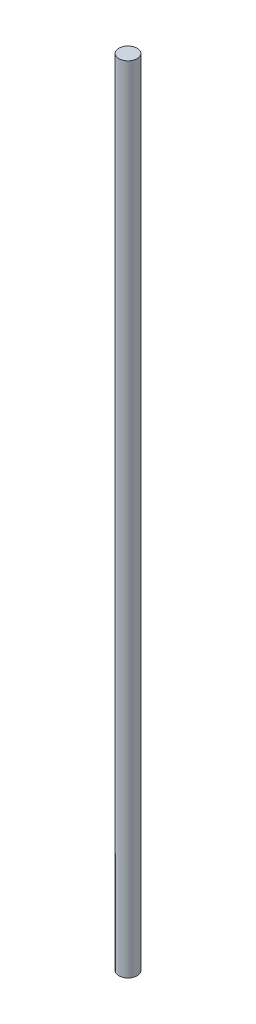
ISO-10303-21;
HEADER;
FILE_DESCRIPTION(('STEP AP214'),'2;1');
FILE_NAME('part.step','',(''),(''),'','','');
FILE_SCHEMA(('AUTOMOTIVE_DESIGN { 1 0 10303 214 1 1 1 1 }'));
ENDSEC;
DATA;
#1=APPLICATION_CONTEXT('core data for automotive mechanical design processes');
#2=APPLICATION_PROTOCOL_DEFINITION('international standard','automotive_design',2000,#1);
#3=PRODUCT_CONTEXT('',#1,'mechanical');
#4=PRODUCT('Part','Part','',(#3));
#5=PRODUCT_RELATED_PRODUCT_CATEGORY('part','',(#4));
#6=PRODUCT_DEFINITION_FORMATION('','',#4);
#7=PRODUCT_DEFINITION_CONTEXT('part definition',#1,'design');
#8=PRODUCT_DEFINITION('design','',#6,#7);
#9=PRODUCT_DEFINITION_SHAPE('','',#8);
#10=(LENGTH_UNIT() NAMED_UNIT(*) SI_UNIT(.MILLI.,.METRE.));
#11=(NAMED_UNIT(*) PLANE_ANGLE_UNIT() SI_UNIT($,.RADIAN.));
#12=(NAMED_UNIT(*) SI_UNIT($,.STERADIAN.) SOLID_ANGLE_UNIT());
#13=UNCERTAINTY_MEASURE_WITH_UNIT(LENGTH_MEASURE(1.E-05),#10,'distance_accuracy_value','');
#14=(GEOMETRIC_REPRESENTATION_CONTEXT(3) GLOBAL_UNCERTAINTY_ASSIGNED_CONTEXT((#13)) GLOBAL_UNIT_ASSIGNED_CONTEXT((#10,
#11,#12)) REPRESENTATION_CONTEXT('',''));
#15=CARTESIAN_POINT('',(0.,0.,0.));
#16=DIRECTION('',(0.,0.,1.));
#17=DIRECTION('',(1.,0.,0.));
#18=AXIS2_PLACEMENT_3D('',#15,#16,#17);
#19=CARTESIAN_POINT('',(0.,366.8,0.));
#20=DIRECTION('',(0.,-1.,0.));
#21=DIRECTION('',(0.,0.,-1.));
#22=AXIS2_PLACEMENT_3D('',#19,#20,#21);
#23=CYLINDRICAL_SURFACE('',#22,4.2);
#24=CARTESIAN_POINT('',(0.,366.8,0.));
#25=DIRECTION('',(0.,1.,0.));
#26=DIRECTION('',(0.,0.,1.));
#27=AXIS2_PLACEMENT_3D('',#24,#25,#26);
#28=CIRCLE('',#27,4.2);
#29=CARTESIAN_POINT('',(0.,366.8,4.2));
#30=VERTEX_POINT('',#29);
#31=EDGE_CURVE('E10',#30,#30,#28,.T.);
#32=ORIENTED_EDGE('',*,*,#31,.F.);
#33=EDGE_LOOP('',(#32));
#34=FACE_BOUND('',#33,.T.);
#35=CARTESIAN_POINT('',(0.,0.,0.));
#36=DIRECTION('',(0.,1.,0.));
#37=DIRECTION('',(0.,0.,1.));
#38=AXIS2_PLACEMENT_3D('',#35,#36,#37);
#39=CIRCLE('',#38,4.2);
#40=CARTESIAN_POINT('',(0.,0.,4.2));
#41=VERTEX_POINT('',#40);
#42=EDGE_CURVE('E33',#41,#41,#39,.T.);
#43=ORIENTED_EDGE('',*,*,#42,.T.);
#44=EDGE_LOOP('',(#43));
#45=FACE_BOUND('',#44,.T.);
#46=ADVANCED_FACE('F30',(#34,#45),#23,.T.);
#47=CARTESIAN_POINT('',(0.,366.8,0.));
#48=DIRECTION('',(0.,1.,0.));
#49=DIRECTION('',(0.,0.,1.));
#50=AXIS2_PLACEMENT_3D('',#47,#48,#49);
#51=PLANE('',#50);
#52=ORIENTED_EDGE('',*,*,#31,.T.);
#53=EDGE_LOOP('',(#52));
#54=FACE_BOUND('',#53,.T.);
#55=ADVANCED_FACE('F45',(#54),#51,.T.);
#56=CARTESIAN_POINT('',(0.,0.,0.));
#57=DIRECTION('',(0.,1.,0.));
#58=DIRECTION('',(0.,0.,1.));
#59=AXIS2_PLACEMENT_3D('',#56,#57,#58);
#60=PLANE('',#59);
#61=ORIENTED_EDGE('',*,*,#42,.F.);
#62=EDGE_LOOP('',(#61));
#63=FACE_BOUND('',#62,.T.);
#64=ADVANCED_FACE('F43',(#63),#60,.F.);
#65=CLOSED_SHELL('',(#46,#55,#64));
#66=MANIFOLD_SOLID_BREP('B2',#65);
#67=ADVANCED_BREP_SHAPE_REPRESENTATION('',(#18,#66),#14);
#68=SHAPE_DEFINITION_REPRESENTATION(#9,#67);
ENDSEC;
END-ISO-10303-21;
